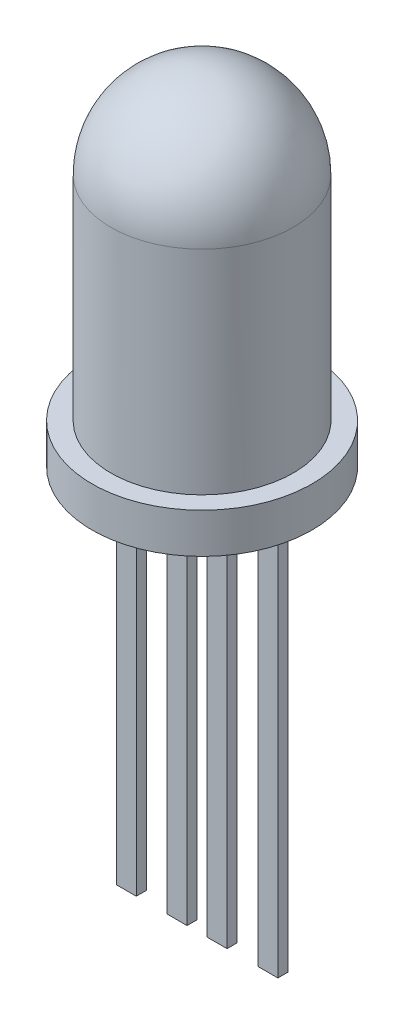
ISO-10303-21;
HEADER;
FILE_DESCRIPTION(('STEP AP214'),'2;1');
FILE_NAME('part.step','',(''),(''),'','','');
FILE_SCHEMA(('AUTOMOTIVE_DESIGN { 1 0 10303 214 1 1 1 1 }'));
ENDSEC;
DATA;
#1=APPLICATION_CONTEXT('core data for automotive mechanical design processes');
#2=APPLICATION_PROTOCOL_DEFINITION('international standard','automotive_design',2000,#1);
#3=PRODUCT_CONTEXT('',#1,'mechanical');
#4=PRODUCT('Part','Part','',(#3));
#5=PRODUCT_RELATED_PRODUCT_CATEGORY('part','',(#4));
#6=PRODUCT_DEFINITION_FORMATION('','',#4);
#7=PRODUCT_DEFINITION_CONTEXT('part definition',#1,'design');
#8=PRODUCT_DEFINITION('design','',#6,#7);
#9=PRODUCT_DEFINITION_SHAPE('','',#8);
#10=(LENGTH_UNIT() NAMED_UNIT(*) SI_UNIT(.MILLI.,.METRE.));
#11=(NAMED_UNIT(*) PLANE_ANGLE_UNIT() SI_UNIT($,.RADIAN.));
#12=(NAMED_UNIT(*) SI_UNIT($,.STERADIAN.) SOLID_ANGLE_UNIT());
#13=UNCERTAINTY_MEASURE_WITH_UNIT(LENGTH_MEASURE(1.E-05),#10,'distance_accuracy_value','');
#14=(GEOMETRIC_REPRESENTATION_CONTEXT(3) GLOBAL_UNCERTAINTY_ASSIGNED_CONTEXT((#13)) GLOBAL_UNIT_ASSIGNED_CONTEXT((#10,
#11,#12)) REPRESENTATION_CONTEXT('',''));
#15=CARTESIAN_POINT('',(0.,0.,0.));
#16=DIRECTION('',(0.,0.,1.));
#17=DIRECTION('',(1.,0.,0.));
#18=AXIS2_PLACEMENT_3D('',#15,#16,#17);
#19=CARTESIAN_POINT('',(0.,0.,0.));
#20=DIRECTION('',(0.,1.,0.));
#21=DIRECTION('',(0.,0.,1.));
#22=AXIS2_PLACEMENT_3D('',#19,#20,#21);
#23=PLANE('',#22);
#24=DIRECTION('',(0.,0.,-1.));
#25=VECTOR('',#24,1.);
#26=CARTESIAN_POINT('',(1.52,0.,-0.125));
#27=LINE('',#26,#25);
#28=CARTESIAN_POINT('',(1.52,0.,0.125));
#29=VERTEX_POINT('',#28);
#30=CARTESIAN_POINT('',(1.52,0.,-0.125));
#31=VERTEX_POINT('',#30);
#32=EDGE_CURVE('E166',#29,#31,#27,.T.);
#33=ORIENTED_EDGE('',*,*,#32,.F.);
#34=DIRECTION('',(-1.,0.,0.));
#35=VECTOR('',#34,1.);
#36=CARTESIAN_POINT('',(1.52,0.,0.125));
#37=LINE('',#36,#35);
#38=CARTESIAN_POINT('',(2.02,0.,0.125));
#39=VERTEX_POINT('',#38);
#40=EDGE_CURVE('E179',#39,#29,#37,.T.);
#41=ORIENTED_EDGE('',*,*,#40,.F.);
#42=DIRECTION('',(0.,0.,1.));
#43=VECTOR('',#42,1.);
#44=CARTESIAN_POINT('',(2.02,0.,-0.125));
#45=LINE('',#44,#43);
#46=CARTESIAN_POINT('',(2.02,0.,-0.125));
#47=VERTEX_POINT('',#46);
#48=EDGE_CURVE('E188',#47,#39,#45,.T.);
#49=ORIENTED_EDGE('',*,*,#48,.F.);
#50=DIRECTION('',(1.,0.,0.));
#51=VECTOR('',#50,1.);
#52=CARTESIAN_POINT('',(1.52,0.,-0.125));
#53=LINE('',#52,#51);
#54=EDGE_CURVE('E169',#31,#47,#53,.T.);
#55=ORIENTED_EDGE('',*,*,#54,.F.);
#56=EDGE_LOOP('',(#33,#41,#49,#55));
#57=FACE_BOUND('',#56,.T.);
#58=DIRECTION('',(0.,0.,-1.));
#59=VECTOR('',#58,1.);
#60=CARTESIAN_POINT('',(-0.75,0.,-0.125));
#61=LINE('',#60,#59);
#62=CARTESIAN_POINT('',(-0.75,0.,0.125));
#63=VERTEX_POINT('',#62);
#64=CARTESIAN_POINT('',(-0.75,0.,-0.125));
#65=VERTEX_POINT('',#64);
#66=EDGE_CURVE('E237',#63,#65,#61,.T.);
#67=ORIENTED_EDGE('',*,*,#66,.F.);
#68=DIRECTION('',(-1.,0.,0.));
#69=VECTOR('',#68,1.);
#70=CARTESIAN_POINT('',(-0.25,0.,0.125));
#71=LINE('',#70,#69);
#72=CARTESIAN_POINT('',(-0.25,0.,0.125));
#73=VERTEX_POINT('',#72);
#74=EDGE_CURVE('E242',#73,#63,#71,.T.);
#75=ORIENTED_EDGE('',*,*,#74,.F.);
#76=DIRECTION('',(0.,0.,1.));
#77=VECTOR('',#76,1.);
#78=CARTESIAN_POINT('',(-0.25,0.,-0.125));
#79=LINE('',#78,#77);
#80=CARTESIAN_POINT('',(-0.25,0.,-0.125));
#81=VERTEX_POINT('',#80);
#82=EDGE_CURVE('E254',#81,#73,#79,.T.);
#83=ORIENTED_EDGE('',*,*,#82,.F.);
#84=DIRECTION('',(1.,0.,0.));
#85=VECTOR('',#84,1.);
#86=CARTESIAN_POINT('',(-0.25,0.,-0.125));
#87=LINE('',#86,#85);
#88=EDGE_CURVE('E251',#65,#81,#87,.T.);
#89=ORIENTED_EDGE('',*,*,#88,.F.);
#90=EDGE_LOOP('',(#67,#75,#83,#89));
#91=FACE_BOUND('',#90,.T.);
#92=CARTESIAN_POINT('',(0.,0.,0.));
#93=DIRECTION('',(0.,-1.,0.));
#94=DIRECTION('',(0.,0.,-1.));
#95=AXIS2_PLACEMENT_3D('',#92,#93,#94);
#96=CIRCLE('',#95,2.75);
#97=CARTESIAN_POINT('',(0.,0.,-2.75));
#98=VERTEX_POINT('',#97);
#99=EDGE_CURVE('E11',#98,#98,#96,.T.);
#100=ORIENTED_EDGE('',*,*,#99,.T.);
#101=EDGE_LOOP('',(#100));
#102=FACE_BOUND('',#101,.T.);
#103=DIRECTION('',(0.,0.,-1.));
#104=VECTOR('',#103,1.);
#105=CARTESIAN_POINT('',(-2.02,0.,-0.125));
#106=LINE('',#105,#104);
#107=CARTESIAN_POINT('',(-2.02,0.,0.125));
#108=VERTEX_POINT('',#107);
#109=CARTESIAN_POINT('',(-2.02,0.,-0.125));
#110=VERTEX_POINT('',#109);
#111=EDGE_CURVE('E204',#108,#110,#106,.T.);
#112=ORIENTED_EDGE('',*,*,#111,.F.);
#113=DIRECTION('',(-1.,0.,0.));
#114=VECTOR('',#113,1.);
#115=CARTESIAN_POINT('',(-1.52,0.,0.125));
#116=LINE('',#115,#114);
#117=CARTESIAN_POINT('',(-1.52,0.,0.125));
#118=VERTEX_POINT('',#117);
#119=EDGE_CURVE('E209',#118,#108,#116,.T.);
#120=ORIENTED_EDGE('',*,*,#119,.F.);
#121=DIRECTION('',(0.,0.,1.));
#122=VECTOR('',#121,1.);
#123=CARTESIAN_POINT('',(-1.52,0.,-0.125));
#124=LINE('',#123,#122);
#125=CARTESIAN_POINT('',(-1.52,0.,-0.125));
#126=VERTEX_POINT('',#125);
#127=EDGE_CURVE('E221',#126,#118,#124,.T.);
#128=ORIENTED_EDGE('',*,*,#127,.F.);
#129=DIRECTION('',(1.,0.,0.));
#130=VECTOR('',#129,1.);
#131=CARTESIAN_POINT('',(-1.52,0.,-0.125));
#132=LINE('',#131,#130);
#133=EDGE_CURVE('E218',#110,#126,#132,.T.);
#134=ORIENTED_EDGE('',*,*,#133,.F.);
#135=EDGE_LOOP('',(#112,#120,#128,#134));
#136=FACE_BOUND('',#135,.T.);
#137=DIRECTION('',(0.,0.,-1.));
#138=VECTOR('',#137,1.);
#139=CARTESIAN_POINT('',(0.25,0.,-0.125));
#140=LINE('',#139,#138);
#141=CARTESIAN_POINT('',(0.25,0.,0.125));
#142=VERTEX_POINT('',#141);
#143=CARTESIAN_POINT('',(0.25,0.,-0.125));
#144=VERTEX_POINT('',#143);
#145=EDGE_CURVE('E165',#142,#144,#140,.T.);
#146=ORIENTED_EDGE('',*,*,#145,.F.);
#147=DIRECTION('',(-1.,0.,0.));
#148=VECTOR('',#147,1.);
#149=CARTESIAN_POINT('',(0.25,0.,0.125));
#150=LINE('',#149,#148);
#151=CARTESIAN_POINT('',(0.75,0.,0.125));
#152=VERTEX_POINT('',#151);
#153=EDGE_CURVE('E162',#152,#142,#150,.T.);
#154=ORIENTED_EDGE('',*,*,#153,.F.);
#155=DIRECTION('',(0.,0.,1.));
#156=VECTOR('',#155,1.);
#157=CARTESIAN_POINT('',(0.75,0.,-0.125));
#158=LINE('',#157,#156);
#159=CARTESIAN_POINT('',(0.75,0.,-0.125));
#160=VERTEX_POINT('',#159);
#161=EDGE_CURVE('E52',#160,#152,#158,.T.);
#162=ORIENTED_EDGE('',*,*,#161,.F.);
#163=DIRECTION('',(1.,0.,0.));
#164=VECTOR('',#163,1.);
#165=CARTESIAN_POINT('',(0.25,0.,-0.125));
#166=LINE('',#165,#164);
#167=EDGE_CURVE('E47',#144,#160,#166,.T.);
#168=ORIENTED_EDGE('',*,*,#167,.F.);
#169=EDGE_LOOP('',(#146,#154,#162,#168));
#170=FACE_BOUND('',#169,.T.);
#171=ADVANCED_FACE('F33',(#57,#91,#102,#136,#170),#23,.F.);
#172=CARTESIAN_POINT('',(0.,-55.2733676975945,0.));
#173=DIRECTION('',(0.,-1.,0.));
#174=DIRECTION('',(0.,0.,-1.));
#175=AXIS2_PLACEMENT_3D('',#172,#173,#174);
#176=CYLINDRICAL_SURFACE('',#175,2.75);
#177=ORIENTED_EDGE('',*,*,#99,.F.);
#178=EDGE_LOOP('',(#177));
#179=FACE_BOUND('',#178,.T.);
#180=CARTESIAN_POINT('',(0.,1.,0.));
#181=DIRECTION('',(0.,-1.,0.));
#182=DIRECTION('',(0.,0.,-1.));
#183=AXIS2_PLACEMENT_3D('',#180,#181,#182);
#184=CIRCLE('',#183,2.75);
#185=CARTESIAN_POINT('',(0.,1.,-2.75));
#186=VERTEX_POINT('',#185);
#187=EDGE_CURVE('E40',#186,#186,#184,.T.);
#188=ORIENTED_EDGE('',*,*,#187,.T.);
#189=EDGE_LOOP('',(#188));
#190=FACE_BOUND('',#189,.T.);
#191=ADVANCED_FACE('F278',(#179,#190),#176,.T.);
#192=CARTESIAN_POINT('',(-2.75,0.999999999999999,0.));
#193=DIRECTION('',(0.,-1.,0.));
#194=DIRECTION('',(0.,0.,-1.));
#195=AXIS2_PLACEMENT_3D('',#192,#193,#194);
#196=PLANE('',#195);
#197=ORIENTED_EDGE('',*,*,#187,.F.);
#198=EDGE_LOOP('',(#197));
#199=FACE_BOUND('',#198,.T.);
#200=CARTESIAN_POINT('',(0.,1.,0.));
#201=DIRECTION('',(0.,-1.,0.));
#202=DIRECTION('',(0.,0.,-1.));
#203=AXIS2_PLACEMENT_3D('',#200,#201,#202);
#204=CIRCLE('',#203,2.28);
#205=CARTESIAN_POINT('',(0.,1.,-2.28));
#206=VERTEX_POINT('',#205);
#207=EDGE_CURVE('E273',#206,#206,#204,.T.);
#208=ORIENTED_EDGE('',*,*,#207,.T.);
#209=EDGE_LOOP('',(#208));
#210=FACE_BOUND('',#209,.T.);
#211=ADVANCED_FACE('F280',(#199,#210),#196,.F.);
#212=CARTESIAN_POINT('',(0.,-55.2733676975945,0.));
#213=DIRECTION('',(0.,-1.,0.));
#214=DIRECTION('',(0.,0.,-1.));
#215=AXIS2_PLACEMENT_3D('',#212,#213,#214);
#216=CYLINDRICAL_SURFACE('',#215,2.28);
#217=ORIENTED_EDGE('',*,*,#207,.F.);
#218=EDGE_LOOP('',(#217));
#219=FACE_BOUND('',#218,.T.);
#220=CARTESIAN_POINT('',(0.,6.32,0.));
#221=DIRECTION('',(0.,-1.,0.));
#222=DIRECTION('',(0.,0.,-1.));
#223=AXIS2_PLACEMENT_3D('',#220,#221,#222);
#224=CIRCLE('',#223,2.28);
#225=CARTESIAN_POINT('',(0.,6.32,-2.28));
#226=VERTEX_POINT('',#225);
#227=EDGE_CURVE('E270',#226,#226,#224,.T.);
#228=ORIENTED_EDGE('',*,*,#227,.T.);
#229=EDGE_LOOP('',(#228));
#230=FACE_BOUND('',#229,.T.);
#231=ADVANCED_FACE('F283',(#219,#230),#216,.T.);
#232=CARTESIAN_POINT('',(0.,6.32,0.));
#233=DIRECTION('',(0.,-1.,0.));
#234=DIRECTION('',(-1.,0.,0.));
#235=AXIS2_PLACEMENT_3D('',#232,#233,#234);
#236=SPHERICAL_SURFACE('',#235,2.28);
#237=ORIENTED_EDGE('',*,*,#227,.F.);
#238=EDGE_LOOP('',(#237));
#239=FACE_BOUND('',#238,.T.);
#240=ADVANCED_FACE('F289',(#239),#236,.T.);
#241=CARTESIAN_POINT('',(-0.75,-10.,-0.125));
#242=DIRECTION('',(1.,0.,0.));
#243=DIRECTION('',(0.,0.,-1.));
#244=AXIS2_PLACEMENT_3D('',#241,#242,#243);
#245=PLANE('',#244);
#246=ORIENTED_EDGE('',*,*,#66,.T.);
#247=DIRECTION('',(0.,1.,0.));
#248=VECTOR('',#247,1.);
#249=CARTESIAN_POINT('',(-0.75,-10.,-0.125));
#250=LINE('',#249,#248);
#251=CARTESIAN_POINT('',(-0.75,-10.,-0.125));
#252=VERTEX_POINT('',#251);
#253=EDGE_CURVE('E267',#252,#65,#250,.T.);
#254=ORIENTED_EDGE('',*,*,#253,.F.);
#255=DIRECTION('',(0.,0.,-1.));
#256=VECTOR('',#255,1.);
#257=CARTESIAN_POINT('',(-0.75,-10.,-0.125));
#258=LINE('',#257,#256);
#259=CARTESIAN_POINT('',(-0.75,-10.,0.125));
#260=VERTEX_POINT('',#259);
#261=EDGE_CURVE('E238',#260,#252,#258,.T.);
#262=ORIENTED_EDGE('',*,*,#261,.F.);
#263=DIRECTION('',(0.,1.,0.));
#264=VECTOR('',#263,1.);
#265=CARTESIAN_POINT('',(-0.75,-10.,0.125));
#266=LINE('',#265,#264);
#267=EDGE_CURVE('E248',#260,#63,#266,.T.);
#268=ORIENTED_EDGE('',*,*,#267,.T.);
#269=EDGE_LOOP('',(#246,#254,#262,#268));
#270=FACE_BOUND('',#269,.T.);
#271=ADVANCED_FACE('F294',(#270),#245,.F.);
#272=CARTESIAN_POINT('',(-0.25,-10.,-0.125));
#273=DIRECTION('',(0.,0.,1.));
#274=DIRECTION('',(1.,0.,0.));
#275=AXIS2_PLACEMENT_3D('',#272,#273,#274);
#276=PLANE('',#275);
#277=ORIENTED_EDGE('',*,*,#88,.T.);
#278=DIRECTION('',(0.,1.,0.));
#279=VECTOR('',#278,1.);
#280=CARTESIAN_POINT('',(-0.25,-10.,-0.125));
#281=LINE('',#280,#279);
#282=CARTESIAN_POINT('',(-0.25,-10.,-0.125));
#283=VERTEX_POINT('',#282);
#284=EDGE_CURVE('E264',#283,#81,#281,.T.);
#285=ORIENTED_EDGE('',*,*,#284,.F.);
#286=DIRECTION('',(1.,0.,0.));
#287=VECTOR('',#286,1.);
#288=CARTESIAN_POINT('',(-0.25,-10.,-0.125));
#289=LINE('',#288,#287);
#290=EDGE_CURVE('E241',#252,#283,#289,.T.);
#291=ORIENTED_EDGE('',*,*,#290,.F.);
#292=ORIENTED_EDGE('',*,*,#253,.T.);
#293=EDGE_LOOP('',(#277,#285,#291,#292));
#294=FACE_BOUND('',#293,.T.);
#295=ADVANCED_FACE('F299',(#294),#276,.F.);
#296=CARTESIAN_POINT('',(-0.25,-10.,-0.125));
#297=DIRECTION('',(-1.,0.,0.));
#298=DIRECTION('',(0.,0.,1.));
#299=AXIS2_PLACEMENT_3D('',#296,#297,#298);
#300=PLANE('',#299);
#301=ORIENTED_EDGE('',*,*,#82,.T.);
#302=DIRECTION('',(0.,1.,0.));
#303=VECTOR('',#302,1.);
#304=CARTESIAN_POINT('',(-0.25,-10.,0.125));
#305=LINE('',#304,#303);
#306=CARTESIAN_POINT('',(-0.25,-10.,0.125));
#307=VERTEX_POINT('',#306);
#308=EDGE_CURVE('E261',#307,#73,#305,.T.);
#309=ORIENTED_EDGE('',*,*,#308,.F.);
#310=DIRECTION('',(0.,0.,1.));
#311=VECTOR('',#310,1.);
#312=CARTESIAN_POINT('',(-0.25,-10.,-0.125));
#313=LINE('',#312,#311);
#314=EDGE_CURVE('E244',#283,#307,#313,.T.);
#315=ORIENTED_EDGE('',*,*,#314,.F.);
#316=ORIENTED_EDGE('',*,*,#284,.T.);
#317=EDGE_LOOP('',(#301,#309,#315,#316));
#318=FACE_BOUND('',#317,.T.);
#319=ADVANCED_FACE('F386',(#318),#300,.F.);
#320=CARTESIAN_POINT('',(-0.25,-10.,0.125));
#321=DIRECTION('',(0.,0.,-1.));
#322=DIRECTION('',(-1.,0.,0.));
#323=AXIS2_PLACEMENT_3D('',#320,#321,#322);
#324=PLANE('',#323);
#325=ORIENTED_EDGE('',*,*,#74,.T.);
#326=ORIENTED_EDGE('',*,*,#267,.F.);
#327=DIRECTION('',(-1.,0.,0.));
#328=VECTOR('',#327,1.);
#329=CARTESIAN_POINT('',(-0.25,-10.,0.125));
#330=LINE('',#329,#328);
#331=EDGE_CURVE('E246',#307,#260,#330,.T.);
#332=ORIENTED_EDGE('',*,*,#331,.F.);
#333=ORIENTED_EDGE('',*,*,#308,.T.);
#334=EDGE_LOOP('',(#325,#326,#332,#333));
#335=FACE_BOUND('',#334,.T.);
#336=ADVANCED_FACE('F382',(#335),#324,.F.);
#337=CARTESIAN_POINT('',(0.,-10.,0.));
#338=DIRECTION('',(0.,-1.,0.));
#339=DIRECTION('',(0.,0.,-1.));
#340=AXIS2_PLACEMENT_3D('',#337,#338,#339);
#341=PLANE('',#340);
#342=ORIENTED_EDGE('',*,*,#261,.T.);
#343=ORIENTED_EDGE('',*,*,#290,.T.);
#344=ORIENTED_EDGE('',*,*,#314,.T.);
#345=ORIENTED_EDGE('',*,*,#331,.T.);
#346=EDGE_LOOP('',(#342,#343,#344,#345));
#347=FACE_BOUND('',#346,.T.);
#348=ADVANCED_FACE('F378',(#347),#341,.T.);
#349=CARTESIAN_POINT('',(-2.02,-10.,-0.125));
#350=DIRECTION('',(1.,0.,0.));
#351=DIRECTION('',(0.,0.,-1.));
#352=AXIS2_PLACEMENT_3D('',#349,#350,#351);
#353=PLANE('',#352);
#354=ORIENTED_EDGE('',*,*,#111,.T.);
#355=DIRECTION('',(0.,1.,0.));
#356=VECTOR('',#355,1.);
#357=CARTESIAN_POINT('',(-2.02,-10.,-0.125));
#358=LINE('',#357,#356);
#359=CARTESIAN_POINT('',(-2.02,-10.,-0.125));
#360=VERTEX_POINT('',#359);
#361=EDGE_CURVE('E234',#360,#110,#358,.T.);
#362=ORIENTED_EDGE('',*,*,#361,.F.);
#363=DIRECTION('',(0.,0.,-1.));
#364=VECTOR('',#363,1.);
#365=CARTESIAN_POINT('',(-2.02,-10.,-0.125));
#366=LINE('',#365,#364);
#367=CARTESIAN_POINT('',(-2.02,-10.,0.125));
#368=VERTEX_POINT('',#367);
#369=EDGE_CURVE('E205',#368,#360,#366,.T.);
#370=ORIENTED_EDGE('',*,*,#369,.F.);
#371=DIRECTION('',(0.,1.,0.));
#372=VECTOR('',#371,1.);
#373=CARTESIAN_POINT('',(-2.02,-10.,0.125));
#374=LINE('',#373,#372);
#375=EDGE_CURVE('E215',#368,#108,#374,.T.);
#376=ORIENTED_EDGE('',*,*,#375,.T.);
#377=EDGE_LOOP('',(#354,#362,#370,#376));
#378=FACE_BOUND('',#377,.T.);
#379=ADVANCED_FACE('F374',(#378),#353,.F.);
#380=CARTESIAN_POINT('',(-1.52,-10.,-0.125));
#381=DIRECTION('',(0.,0.,1.));
#382=DIRECTION('',(1.,0.,0.));
#383=AXIS2_PLACEMENT_3D('',#380,#381,#382);
#384=PLANE('',#383);
#385=ORIENTED_EDGE('',*,*,#133,.T.);
#386=DIRECTION('',(0.,1.,0.));
#387=VECTOR('',#386,1.);
#388=CARTESIAN_POINT('',(-1.52,-10.,-0.125));
#389=LINE('',#388,#387);
#390=CARTESIAN_POINT('',(-1.52,-10.,-0.125));
#391=VERTEX_POINT('',#390);
#392=EDGE_CURVE('E231',#391,#126,#389,.T.);
#393=ORIENTED_EDGE('',*,*,#392,.F.);
#394=DIRECTION('',(1.,0.,0.));
#395=VECTOR('',#394,1.);
#396=CARTESIAN_POINT('',(-1.52,-10.,-0.125));
#397=LINE('',#396,#395);
#398=EDGE_CURVE('E208',#360,#391,#397,.T.);
#399=ORIENTED_EDGE('',*,*,#398,.F.);
#400=ORIENTED_EDGE('',*,*,#361,.T.);
#401=EDGE_LOOP('',(#385,#393,#399,#400));
#402=FACE_BOUND('',#401,.T.);
#403=ADVANCED_FACE('F370',(#402),#384,.F.);
#404=CARTESIAN_POINT('',(-1.52,-10.,-0.125));
#405=DIRECTION('',(-1.,0.,0.));
#406=DIRECTION('',(0.,0.,1.));
#407=AXIS2_PLACEMENT_3D('',#404,#405,#406);
#408=PLANE('',#407);
#409=ORIENTED_EDGE('',*,*,#127,.T.);
#410=DIRECTION('',(0.,1.,0.));
#411=VECTOR('',#410,1.);
#412=CARTESIAN_POINT('',(-1.52,-10.,0.125));
#413=LINE('',#412,#411);
#414=CARTESIAN_POINT('',(-1.52,-10.,0.125));
#415=VERTEX_POINT('',#414);
#416=EDGE_CURVE('E228',#415,#118,#413,.T.);
#417=ORIENTED_EDGE('',*,*,#416,.F.);
#418=DIRECTION('',(0.,0.,1.));
#419=VECTOR('',#418,1.);
#420=CARTESIAN_POINT('',(-1.52,-10.,-0.125));
#421=LINE('',#420,#419);
#422=EDGE_CURVE('E211',#391,#415,#421,.T.);
#423=ORIENTED_EDGE('',*,*,#422,.F.);
#424=ORIENTED_EDGE('',*,*,#392,.T.);
#425=EDGE_LOOP('',(#409,#417,#423,#424));
#426=FACE_BOUND('',#425,.T.);
#427=ADVANCED_FACE('F366',(#426),#408,.F.);
#428=CARTESIAN_POINT('',(-1.52,-10.,0.125));
#429=DIRECTION('',(0.,0.,-1.));
#430=DIRECTION('',(-1.,0.,0.));
#431=AXIS2_PLACEMENT_3D('',#428,#429,#430);
#432=PLANE('',#431);
#433=ORIENTED_EDGE('',*,*,#119,.T.);
#434=ORIENTED_EDGE('',*,*,#375,.F.);
#435=DIRECTION('',(-1.,0.,0.));
#436=VECTOR('',#435,1.);
#437=CARTESIAN_POINT('',(-1.52,-10.,0.125));
#438=LINE('',#437,#436);
#439=EDGE_CURVE('E213',#415,#368,#438,.T.);
#440=ORIENTED_EDGE('',*,*,#439,.F.);
#441=ORIENTED_EDGE('',*,*,#416,.T.);
#442=EDGE_LOOP('',(#433,#434,#440,#441));
#443=FACE_BOUND('',#442,.T.);
#444=ADVANCED_FACE('F362',(#443),#432,.F.);
#445=CARTESIAN_POINT('',(0.,-10.,0.));
#446=DIRECTION('',(0.,-1.,0.));
#447=DIRECTION('',(0.,0.,-1.));
#448=AXIS2_PLACEMENT_3D('',#445,#446,#447);
#449=PLANE('',#448);
#450=ORIENTED_EDGE('',*,*,#369,.T.);
#451=ORIENTED_EDGE('',*,*,#398,.T.);
#452=ORIENTED_EDGE('',*,*,#422,.T.);
#453=ORIENTED_EDGE('',*,*,#439,.T.);
#454=EDGE_LOOP('',(#450,#451,#452,#453));
#455=FACE_BOUND('',#454,.T.);
#456=ADVANCED_FACE('F358',(#455),#449,.T.);
#457=CARTESIAN_POINT('',(1.52,-10.,-0.125));
#458=DIRECTION('',(1.,0.,0.));
#459=DIRECTION('',(0.,0.,-1.));
#460=AXIS2_PLACEMENT_3D('',#457,#458,#459);
#461=PLANE('',#460);
#462=ORIENTED_EDGE('',*,*,#32,.T.);
#463=DIRECTION('',(0.,1.,0.));
#464=VECTOR('',#463,1.);
#465=CARTESIAN_POINT('',(1.52,-10.,-0.125));
#466=LINE('',#465,#464);
#467=CARTESIAN_POINT('',(1.52,-10.,-0.125));
#468=VERTEX_POINT('',#467);
#469=EDGE_CURVE('E201',#468,#31,#466,.T.);
#470=ORIENTED_EDGE('',*,*,#469,.F.);
#471=DIRECTION('',(0.,0.,-1.));
#472=VECTOR('',#471,1.);
#473=CARTESIAN_POINT('',(1.52,-10.,-0.125));
#474=LINE('',#473,#472);
#475=CARTESIAN_POINT('',(1.52,-10.,0.125));
#476=VERTEX_POINT('',#475);
#477=EDGE_CURVE('E175',#476,#468,#474,.T.);
#478=ORIENTED_EDGE('',*,*,#477,.F.);
#479=DIRECTION('',(0.,1.,0.));
#480=VECTOR('',#479,1.);
#481=CARTESIAN_POINT('',(1.52,-10.,0.125));
#482=LINE('',#481,#480);
#483=EDGE_CURVE('E184',#476,#29,#482,.T.);
#484=ORIENTED_EDGE('',*,*,#483,.T.);
#485=EDGE_LOOP('',(#462,#470,#478,#484));
#486=FACE_BOUND('',#485,.T.);
#487=ADVANCED_FACE('F354',(#486),#461,.F.);
#488=CARTESIAN_POINT('',(1.52,-10.,-0.125));
#489=DIRECTION('',(0.,0.,1.));
#490=DIRECTION('',(1.,0.,0.));
#491=AXIS2_PLACEMENT_3D('',#488,#489,#490);
#492=PLANE('',#491);
#493=ORIENTED_EDGE('',*,*,#54,.T.);
#494=DIRECTION('',(0.,1.,0.));
#495=VECTOR('',#494,1.);
#496=CARTESIAN_POINT('',(2.02,-10.,-0.125));
#497=LINE('',#496,#495);
#498=CARTESIAN_POINT('',(2.02,-10.,-0.125));
#499=VERTEX_POINT('',#498);
#500=EDGE_CURVE('E198',#499,#47,#497,.T.);
#501=ORIENTED_EDGE('',*,*,#500,.F.);
#502=DIRECTION('',(1.,0.,0.));
#503=VECTOR('',#502,1.);
#504=CARTESIAN_POINT('',(1.52,-10.,-0.125));
#505=LINE('',#504,#503);
#506=EDGE_CURVE('E178',#468,#499,#505,.T.);
#507=ORIENTED_EDGE('',*,*,#506,.F.);
#508=ORIENTED_EDGE('',*,*,#469,.T.);
#509=EDGE_LOOP('',(#493,#501,#507,#508));
#510=FACE_BOUND('',#509,.T.);
#511=ADVANCED_FACE('F350',(#510),#492,.F.);
#512=CARTESIAN_POINT('',(2.02,-10.,-0.125));
#513=DIRECTION('',(-1.,0.,0.));
#514=DIRECTION('',(0.,0.,1.));
#515=AXIS2_PLACEMENT_3D('',#512,#513,#514);
#516=PLANE('',#515);
#517=ORIENTED_EDGE('',*,*,#48,.T.);
#518=DIRECTION('',(0.,1.,0.));
#519=VECTOR('',#518,1.);
#520=CARTESIAN_POINT('',(2.02,-10.,0.125));
#521=LINE('',#520,#519);
#522=CARTESIAN_POINT('',(2.02,-10.,0.125));
#523=VERTEX_POINT('',#522);
#524=EDGE_CURVE('E195',#523,#39,#521,.T.);
#525=ORIENTED_EDGE('',*,*,#524,.F.);
#526=DIRECTION('',(0.,0.,1.));
#527=VECTOR('',#526,1.);
#528=CARTESIAN_POINT('',(2.02,-10.,-0.125));
#529=LINE('',#528,#527);
#530=EDGE_CURVE('E181',#499,#523,#529,.T.);
#531=ORIENTED_EDGE('',*,*,#530,.F.);
#532=ORIENTED_EDGE('',*,*,#500,.T.);
#533=EDGE_LOOP('',(#517,#525,#531,#532));
#534=FACE_BOUND('',#533,.T.);
#535=ADVANCED_FACE('F346',(#534),#516,.F.);
#536=CARTESIAN_POINT('',(1.52,-10.,0.125));
#537=DIRECTION('',(0.,0.,-1.));
#538=DIRECTION('',(-1.,0.,0.));
#539=AXIS2_PLACEMENT_3D('',#536,#537,#538);
#540=PLANE('',#539);
#541=ORIENTED_EDGE('',*,*,#40,.T.);
#542=ORIENTED_EDGE('',*,*,#483,.F.);
#543=DIRECTION('',(-1.,0.,0.));
#544=VECTOR('',#543,1.);
#545=CARTESIAN_POINT('',(1.52,-10.,0.125));
#546=LINE('',#545,#544);
#547=EDGE_CURVE('E183',#523,#476,#546,.T.);
#548=ORIENTED_EDGE('',*,*,#547,.F.);
#549=ORIENTED_EDGE('',*,*,#524,.T.);
#550=EDGE_LOOP('',(#541,#542,#548,#549));
#551=FACE_BOUND('',#550,.T.);
#552=ADVANCED_FACE('F342',(#551),#540,.F.);
#553=CARTESIAN_POINT('',(0.,-10.,0.));
#554=DIRECTION('',(0.,1.,0.));
#555=DIRECTION('',(0.,0.,1.));
#556=AXIS2_PLACEMENT_3D('',#553,#554,#555);
#557=PLANE('',#556);
#558=ORIENTED_EDGE('',*,*,#477,.T.);
#559=ORIENTED_EDGE('',*,*,#506,.T.);
#560=ORIENTED_EDGE('',*,*,#530,.T.);
#561=ORIENTED_EDGE('',*,*,#547,.T.);
#562=EDGE_LOOP('',(#558,#559,#560,#561));
#563=FACE_BOUND('',#562,.T.);
#564=ADVANCED_FACE('F339',(#563),#557,.F.);
#565=CARTESIAN_POINT('',(0.25,-10.,-0.125));
#566=DIRECTION('',(1.,0.,0.));
#567=DIRECTION('',(0.,0.,-1.));
#568=AXIS2_PLACEMENT_3D('',#565,#566,#567);
#569=PLANE('',#568);
#570=ORIENTED_EDGE('',*,*,#145,.T.);
#571=DIRECTION('',(0.,1.,0.));
#572=VECTOR('',#571,1.);
#573=CARTESIAN_POINT('',(0.25,-10.,-0.125));
#574=LINE('',#573,#572);
#575=CARTESIAN_POINT('',(0.25,-10.,-0.125));
#576=VERTEX_POINT('',#575);
#577=EDGE_CURVE('E146',#576,#144,#574,.T.);
#578=ORIENTED_EDGE('',*,*,#577,.F.);
#579=DIRECTION('',(0.,0.,-1.));
#580=VECTOR('',#579,1.);
#581=CARTESIAN_POINT('',(0.25,-10.,-0.125));
#582=LINE('',#581,#580);
#583=CARTESIAN_POINT('',(0.25,-10.,0.125));
#584=VERTEX_POINT('',#583);
#585=EDGE_CURVE('E153',#584,#576,#582,.T.);
#586=ORIENTED_EDGE('',*,*,#585,.F.);
#587=DIRECTION('',(0.,1.,0.));
#588=VECTOR('',#587,1.);
#589=CARTESIAN_POINT('',(0.25,-10.,0.125));
#590=LINE('',#589,#588);
#591=EDGE_CURVE('E317',#584,#142,#590,.T.);
#592=ORIENTED_EDGE('',*,*,#591,.T.);
#593=EDGE_LOOP('',(#570,#578,#586,#592));
#594=FACE_BOUND('',#593,.T.);
#595=ADVANCED_FACE('F164',(#594),#569,.F.);
#596=CARTESIAN_POINT('',(0.25,-10.,-0.125));
#597=DIRECTION('',(0.,0.,1.));
#598=DIRECTION('',(1.,0.,0.));
#599=AXIS2_PLACEMENT_3D('',#596,#597,#598);
#600=PLANE('',#599);
#601=ORIENTED_EDGE('',*,*,#167,.T.);
#602=DIRECTION('',(0.,1.,0.));
#603=VECTOR('',#602,1.);
#604=CARTESIAN_POINT('',(0.75,-10.,-0.125));
#605=LINE('',#604,#603);
#606=CARTESIAN_POINT('',(0.75,-10.,-0.125));
#607=VERTEX_POINT('',#606);
#608=EDGE_CURVE('E149',#607,#160,#605,.T.);
#609=ORIENTED_EDGE('',*,*,#608,.F.);
#610=DIRECTION('',(1.,0.,0.));
#611=VECTOR('',#610,1.);
#612=CARTESIAN_POINT('',(0.25,-10.,-0.125));
#613=LINE('',#612,#611);
#614=EDGE_CURVE('E142',#576,#607,#613,.T.);
#615=ORIENTED_EDGE('',*,*,#614,.F.);
#616=ORIENTED_EDGE('',*,*,#577,.T.);
#617=EDGE_LOOP('',(#601,#609,#615,#616));
#618=FACE_BOUND('',#617,.T.);
#619=ADVANCED_FACE('F144',(#618),#600,.F.);
#620=CARTESIAN_POINT('',(0.75,-10.,-0.125));
#621=DIRECTION('',(-1.,0.,0.));
#622=DIRECTION('',(0.,0.,1.));
#623=AXIS2_PLACEMENT_3D('',#620,#621,#622);
#624=PLANE('',#623);
#625=ORIENTED_EDGE('',*,*,#161,.T.);
#626=DIRECTION('',(0.,1.,0.));
#627=VECTOR('',#626,1.);
#628=CARTESIAN_POINT('',(0.75,-10.,0.125));
#629=LINE('',#628,#627);
#630=CARTESIAN_POINT('',(0.75,-10.,0.125));
#631=VERTEX_POINT('',#630);
#632=EDGE_CURVE('E171',#631,#152,#629,.T.);
#633=ORIENTED_EDGE('',*,*,#632,.F.);
#634=DIRECTION('',(0.,0.,1.));
#635=VECTOR('',#634,1.);
#636=CARTESIAN_POINT('',(0.75,-10.,-0.125));
#637=LINE('',#636,#635);
#638=EDGE_CURVE('E152',#607,#631,#637,.T.);
#639=ORIENTED_EDGE('',*,*,#638,.F.);
#640=ORIENTED_EDGE('',*,*,#608,.T.);
#641=EDGE_LOOP('',(#625,#633,#639,#640));
#642=FACE_BOUND('',#641,.T.);
#643=ADVANCED_FACE('F326',(#642),#624,.F.);
#644=CARTESIAN_POINT('',(0.25,-10.,0.125));
#645=DIRECTION('',(0.,0.,-1.));
#646=DIRECTION('',(-1.,0.,0.));
#647=AXIS2_PLACEMENT_3D('',#644,#645,#646);
#648=PLANE('',#647);
#649=ORIENTED_EDGE('',*,*,#153,.T.);
#650=ORIENTED_EDGE('',*,*,#591,.F.);
#651=DIRECTION('',(-1.,0.,0.));
#652=VECTOR('',#651,1.);
#653=CARTESIAN_POINT('',(0.25,-10.,0.125));
#654=LINE('',#653,#652);
#655=EDGE_CURVE('E158',#631,#584,#654,.T.);
#656=ORIENTED_EDGE('',*,*,#655,.F.);
#657=ORIENTED_EDGE('',*,*,#632,.T.);
#658=EDGE_LOOP('',(#649,#650,#656,#657));
#659=FACE_BOUND('',#658,.T.);
#660=ADVANCED_FACE('F316',(#659),#648,.F.);
#661=CARTESIAN_POINT('',(0.,-10.,0.));
#662=DIRECTION('',(0.,1.,0.));
#663=DIRECTION('',(0.,0.,1.));
#664=AXIS2_PLACEMENT_3D('',#661,#662,#663);
#665=PLANE('',#664);
#666=ORIENTED_EDGE('',*,*,#585,.T.);
#667=ORIENTED_EDGE('',*,*,#614,.T.);
#668=ORIENTED_EDGE('',*,*,#638,.T.);
#669=ORIENTED_EDGE('',*,*,#655,.T.);
#670=EDGE_LOOP('',(#666,#667,#668,#669));
#671=FACE_BOUND('',#670,.T.);
#672=ADVANCED_FACE('F156',(#671),#665,.F.);
#673=CLOSED_SHELL('',(#171,#191,#211,#231,#240,#271,#295,#319,#336,#348,#379,#403,#427,#444,
#456,#487,#511,#535,#552,#564,#595,#619,#643,#660,#672));
#674=MANIFOLD_SOLID_BREP('B2',#673);
#675=ADVANCED_BREP_SHAPE_REPRESENTATION('',(#18,#674),#14);
#676=SHAPE_DEFINITION_REPRESENTATION(#9,#675);
ENDSEC;
END-ISO-10303-21;
